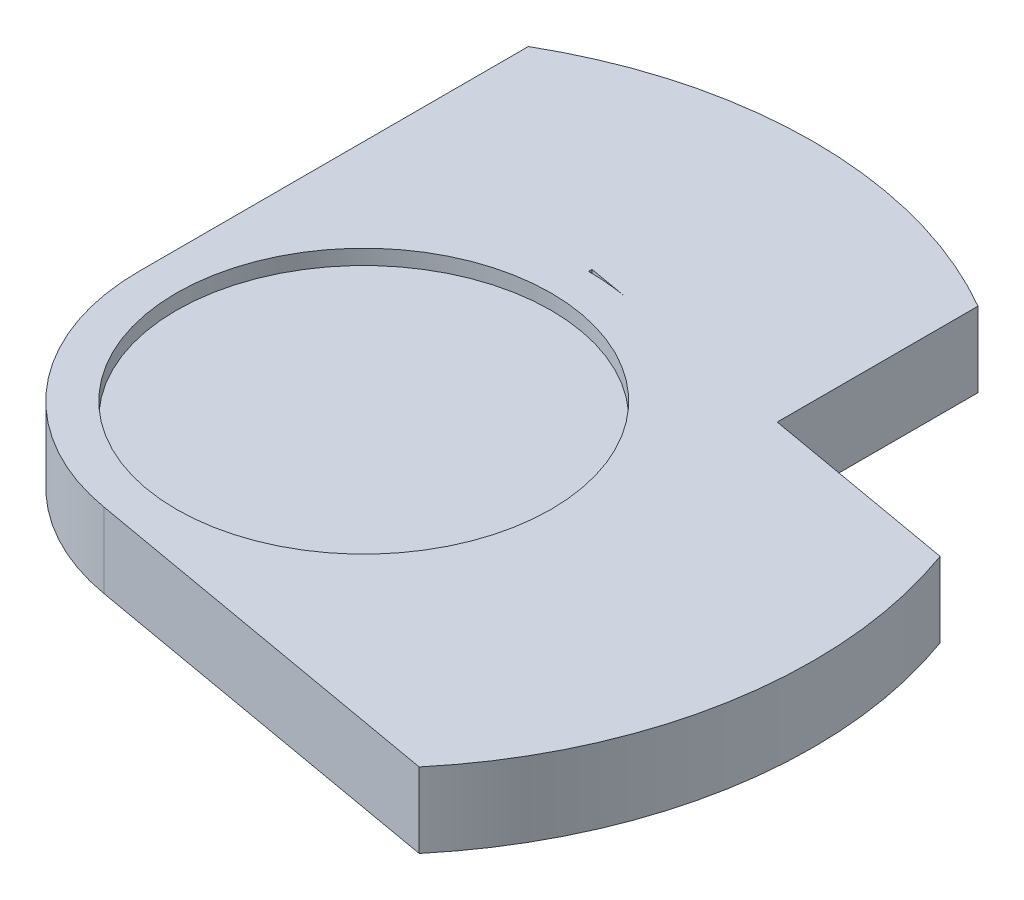
ISO-10303-21;
HEADER;
FILE_DESCRIPTION(('STEP AP214'),'2;1');
FILE_NAME('part.step','',(''),(''),'','','');
FILE_SCHEMA(('AUTOMOTIVE_DESIGN { 1 0 10303 214 1 1 1 1 }'));
ENDSEC;
DATA;
#1=APPLICATION_CONTEXT('core data for automotive mechanical design processes');
#2=APPLICATION_PROTOCOL_DEFINITION('international standard','automotive_design',2000,#1);
#3=PRODUCT_CONTEXT('',#1,'mechanical');
#4=PRODUCT('Part','Part','',(#3));
#5=PRODUCT_RELATED_PRODUCT_CATEGORY('part','',(#4));
#6=PRODUCT_DEFINITION_FORMATION('','',#4);
#7=PRODUCT_DEFINITION_CONTEXT('part definition',#1,'design');
#8=PRODUCT_DEFINITION('design','',#6,#7);
#9=PRODUCT_DEFINITION_SHAPE('','',#8);
#10=(LENGTH_UNIT() NAMED_UNIT(*) SI_UNIT(.MILLI.,.METRE.));
#11=(NAMED_UNIT(*) PLANE_ANGLE_UNIT() SI_UNIT($,.RADIAN.));
#12=(NAMED_UNIT(*) SI_UNIT($,.STERADIAN.) SOLID_ANGLE_UNIT());
#13=UNCERTAINTY_MEASURE_WITH_UNIT(LENGTH_MEASURE(1.E-05),#10,'distance_accuracy_value','');
#14=(GEOMETRIC_REPRESENTATION_CONTEXT(3) GLOBAL_UNCERTAINTY_ASSIGNED_CONTEXT((#13)) GLOBAL_UNIT_ASSIGNED_CONTEXT((#10,
#11,#12)) REPRESENTATION_CONTEXT('',''));
#15=CARTESIAN_POINT('',(0.,0.,0.));
#16=DIRECTION('',(0.,0.,1.));
#17=DIRECTION('',(1.,0.,0.));
#18=AXIS2_PLACEMENT_3D('',#15,#16,#17);
#19=CARTESIAN_POINT('',(3.,1.,0.));
#20=DIRECTION('',(-1.,0.,0.));
#21=DIRECTION('',(0.,0.,1.));
#22=AXIS2_PLACEMENT_3D('',#19,#20,#21);
#23=PLANE('',#22);
#24=DIRECTION('',(0.,-1.,0.));
#25=VECTOR('',#24,1.);
#26=CARTESIAN_POINT('',(3.,1.,-5.19615242270621));
#27=LINE('',#26,#25);
#28=CARTESIAN_POINT('',(3.,1.,-5.19615242270621));
#29=VERTEX_POINT('',#28);
#30=CARTESIAN_POINT('',(3.,0.,-5.19615242270621));
#31=VERTEX_POINT('',#30);
#32=EDGE_CURVE('E60',#29,#31,#27,.T.);
#33=ORIENTED_EDGE('',*,*,#32,.F.);
#34=DIRECTION('',(0.,0.,-1.));
#35=VECTOR('',#34,1.);
#36=CARTESIAN_POINT('',(3.,1.,0.));
#37=LINE('',#36,#35);
#38=CARTESIAN_POINT('',(3.,1.,-2.51729889353182));
#39=VERTEX_POINT('',#38);
#40=EDGE_CURVE('E125',#39,#29,#37,.T.);
#41=ORIENTED_EDGE('',*,*,#40,.F.);
#42=DIRECTION('',(0.,-1.,0.));
#43=VECTOR('',#42,1.);
#44=CARTESIAN_POINT('',(3.,1.,-2.51729889353182));
#45=LINE('',#44,#43);
#46=CARTESIAN_POINT('',(3.,0.,-2.51729889353182));
#47=VERTEX_POINT('',#46);
#48=EDGE_CURVE('E161',#39,#47,#45,.T.);
#49=ORIENTED_EDGE('',*,*,#48,.T.);
#50=DIRECTION('',(0.,0.,-1.));
#51=VECTOR('',#50,1.);
#52=CARTESIAN_POINT('',(3.,0.,0.));
#53=LINE('',#52,#51);
#54=EDGE_CURVE('E128',#47,#31,#53,.T.);
#55=ORIENTED_EDGE('',*,*,#54,.T.);
#56=EDGE_LOOP('',(#33,#41,#49,#55));
#57=FACE_BOUND('',#56,.T.);
#58=ADVANCED_FACE('F37',(#57),#23,.F.);
#59=CARTESIAN_POINT('',(-3.,1.,0.));
#60=DIRECTION('',(-1.,0.,0.));
#61=DIRECTION('',(0.,0.,1.));
#62=AXIS2_PLACEMENT_3D('',#59,#60,#61);
#63=PLANE('',#62);
#64=DIRECTION('',(0.,0.,-1.));
#65=VECTOR('',#64,1.);
#66=CARTESIAN_POINT('',(-3.,1.,0.));
#67=LINE('',#66,#65);
#68=CARTESIAN_POINT('',(-3.,1.,0.));
#69=VERTEX_POINT('',#68);
#70=CARTESIAN_POINT('',(-3.,1.,-5.19615242270606));
#71=VERTEX_POINT('',#70);
#72=EDGE_CURVE('E136',#69,#71,#67,.T.);
#73=ORIENTED_EDGE('',*,*,#72,.T.);
#74=DIRECTION('',(0.,-1.,0.));
#75=VECTOR('',#74,1.);
#76=CARTESIAN_POINT('',(-3.,1.,-5.19615242270606));
#77=LINE('',#76,#75);
#78=CARTESIAN_POINT('',(-3.,0.,-5.19615242270606));
#79=VERTEX_POINT('',#78);
#80=EDGE_CURVE('E115',#71,#79,#77,.T.);
#81=ORIENTED_EDGE('',*,*,#80,.T.);
#82=DIRECTION('',(0.,0.,-1.));
#83=VECTOR('',#82,1.);
#84=CARTESIAN_POINT('',(-3.,0.,0.));
#85=LINE('',#84,#83);
#86=CARTESIAN_POINT('',(-3.,0.,0.));
#87=VERTEX_POINT('',#86);
#88=EDGE_CURVE('E163',#87,#79,#85,.T.);
#89=ORIENTED_EDGE('',*,*,#88,.F.);
#90=DIRECTION('',(0.,-1.,0.));
#91=VECTOR('',#90,1.);
#92=CARTESIAN_POINT('',(-3.,1.,0.));
#93=LINE('',#92,#91);
#94=EDGE_CURVE('E177',#69,#87,#93,.T.);
#95=ORIENTED_EDGE('',*,*,#94,.F.);
#96=EDGE_LOOP('',(#73,#81,#89,#95));
#97=FACE_BOUND('',#96,.T.);
#98=ADVANCED_FACE('F244',(#97),#63,.T.);
#99=CARTESIAN_POINT('',(-0.520952490067851,1.,2.95439650758947));
#100=DIRECTION('',(-0.173652274999197,0.,0.984807030533192));
#101=DIRECTION('',(0.984807030533192,0.,0.173652274999197));
#102=AXIS2_PLACEMENT_3D('',#99,#100,#101);
#103=PLANE('',#102);
#104=DIRECTION('',(-0.984807030533192,0.,-0.173652274999197));
#105=VECTOR('',#104,1.);
#106=CARTESIAN_POINT('',(-0.520952490067851,0.,2.95439650758947));
#107=LINE('',#106,#105);
#108=CARTESIAN_POINT('',(4.59626914104232,0.,3.85672269979412));
#109=VERTEX_POINT('',#108);
#110=CARTESIAN_POINT('',(-0.508900003537394,0.,2.95652173785339));
#111=VERTEX_POINT('',#110);
#112=EDGE_CURVE('E170',#109,#111,#107,.T.);
#113=ORIENTED_EDGE('',*,*,#112,.F.);
#114=DIRECTION('',(0.,-1.,0.));
#115=VECTOR('',#114,1.);
#116=CARTESIAN_POINT('',(4.59626914104232,1.,3.85672269979412));
#117=LINE('',#116,#115);
#118=CARTESIAN_POINT('',(4.59626914104232,1.,3.85672269979412));
#119=VERTEX_POINT('',#118);
#120=EDGE_CURVE('E52',#109,#119,#117,.F.);
#121=ORIENTED_EDGE('',*,*,#120,.T.);
#122=DIRECTION('',(-0.984807030533192,0.,-0.173652274999197));
#123=VECTOR('',#122,1.);
#124=CARTESIAN_POINT('',(-0.520952490067851,1.,2.95439650758947));
#125=LINE('',#124,#123);
#126=CARTESIAN_POINT('',(-0.508900003537394,1.,2.95652173785339));
#127=VERTEX_POINT('',#126);
#128=EDGE_CURVE('E40',#119,#127,#125,.T.);
#129=ORIENTED_EDGE('',*,*,#128,.T.);
#130=DIRECTION('',(0.,-1.,0.));
#131=VECTOR('',#130,1.);
#132=CARTESIAN_POINT('',(-0.508900003537394,1.,2.95652173785339));
#133=LINE('',#132,#131);
#134=EDGE_CURVE('E191',#127,#111,#133,.T.);
#135=ORIENTED_EDGE('',*,*,#134,.T.);
#136=EDGE_LOOP('',(#113,#121,#129,#135));
#137=FACE_BOUND('',#136,.T.);
#138=ADVANCED_FACE('F248',(#137),#103,.T.);
#139=CARTESIAN_POINT('',(0.520944533000813,1.,-2.95442325903662));
#140=DIRECTION('',(0.173648177666938,0.,-0.984807753012207));
#141=DIRECTION('',(-0.984807753012207,0.,-0.173648177666938));
#142=AXIS2_PLACEMENT_3D('',#139,#140,#141);
#143=PLANE('',#142);
#144=DIRECTION('',(0.984807753012207,0.,0.173648177666938));
#145=VECTOR('',#144,1.);
#146=CARTESIAN_POINT('',(0.520944533000813,1.,-2.95442325903662));
#147=LINE('',#146,#145);
#148=CARTESIAN_POINT('',(5.63815572471542,1.,-2.05212085995398));
#149=VERTEX_POINT('',#148);
#150=EDGE_CURVE('E135',#39,#149,#147,.T.);
#151=ORIENTED_EDGE('',*,*,#150,.T.);
#152=DIRECTION('',(0.,-1.,0.));
#153=VECTOR('',#152,1.);
#154=CARTESIAN_POINT('',(5.63815572471542,1.,-2.05212085995398));
#155=LINE('',#154,#153);
#156=CARTESIAN_POINT('',(5.63815572471542,0.,-2.05212085995398));
#157=VERTEX_POINT('',#156);
#158=EDGE_CURVE('E213',#149,#157,#155,.T.);
#159=ORIENTED_EDGE('',*,*,#158,.T.);
#160=DIRECTION('',(0.984807753012207,0.,0.173648177666938));
#161=VECTOR('',#160,1.);
#162=CARTESIAN_POINT('',(0.520944533000813,0.,-2.95442325903662));
#163=LINE('',#162,#161);
#164=EDGE_CURVE('E173',#47,#157,#163,.T.);
#165=ORIENTED_EDGE('',*,*,#164,.F.);
#166=ORIENTED_EDGE('',*,*,#48,.F.);
#167=EDGE_LOOP('',(#151,#159,#165,#166));
#168=FACE_BOUND('',#167,.T.);
#169=ADVANCED_FACE('F212',(#168),#143,.T.);
#170=CARTESIAN_POINT('',(0.,1.,0.));
#171=DIRECTION('',(0.,1.,0.));
#172=DIRECTION('',(0.,0.,1.));
#173=AXIS2_PLACEMENT_3D('',#170,#171,#172);
#174=PLANE('',#173);
#175=CARTESIAN_POINT('',(0.,1.,0.));
#176=DIRECTION('',(0.,1.,0.));
#177=DIRECTION('',(0.,0.,1.));
#178=AXIS2_PLACEMENT_3D('',#175,#176,#177);
#179=CIRCLE('',#178,2.5);
#180=CARTESIAN_POINT('',(0.,1.,2.5));
#181=VERTEX_POINT('',#180);
#182=EDGE_CURVE('E129',#181,#181,#179,.T.);
#183=ORIENTED_EDGE('',*,*,#182,.F.);
#184=EDGE_LOOP('',(#183));
#185=FACE_BOUND('',#184,.T.);
#186=DIRECTION('',(0.984807753012207,0.,0.173648177666938));
#187=VECTOR('',#186,1.);
#188=CARTESIAN_POINT('',(0.520944533000813,1.,-2.95442325903662));
#189=LINE('',#188,#187);
#190=CARTESIAN_POINT('',(0.,1.,-3.04627983565724));
#191=VERTEX_POINT('',#190);
#192=CARTESIAN_POINT('',(0.520944533000813,1.,-2.95442325903662));
#193=VERTEX_POINT('',#192);
#194=EDGE_CURVE('E151',#191,#193,#189,.T.);
#195=ORIENTED_EDGE('',*,*,#194,.T.);
#196=CARTESIAN_POINT('',(0.,1.,0.));
#197=DIRECTION('',(0.,1.,0.));
#198=DIRECTION('',(0.,0.,1.));
#199=AXIS2_PLACEMENT_3D('',#196,#197,#198);
#200=CIRCLE('',#199,3.);
#201=CARTESIAN_POINT('',(0.,1.,-3.));
#202=VERTEX_POINT('',#201);
#203=EDGE_CURVE('E156',#193,#202,#200,.T.);
#204=ORIENTED_EDGE('',*,*,#203,.T.);
#205=DIRECTION('',(0.,0.,1.));
#206=VECTOR('',#205,1.);
#207=CARTESIAN_POINT('',(0.,1.,0.));
#208=LINE('',#207,#206);
#209=EDGE_CURVE('E158',#191,#202,#208,.T.);
#210=ORIENTED_EDGE('',*,*,#209,.F.);
#211=EDGE_LOOP('',(#195,#204,#210));
#212=FACE_BOUND('',#211,.T.);
#213=ORIENTED_EDGE('',*,*,#128,.F.);
#214=CARTESIAN_POINT('',(1.31838984174237E-13,1.,4.9960036108132E-13));
#215=DIRECTION('',(0.,-1.,0.));
#216=DIRECTION('',(0.,0.,-1.));
#217=AXIS2_PLACEMENT_3D('',#214,#215,#216);
#218=CIRCLE('',#217,6.);
#219=EDGE_CURVE('E120',#149,#119,#218,.T.);
#220=ORIENTED_EDGE('',*,*,#219,.F.);
#221=ORIENTED_EDGE('',*,*,#150,.F.);
#222=ORIENTED_EDGE('',*,*,#40,.T.);
#223=EDGE_CURVE('E112',#71,#29,#218,.T.);
#224=ORIENTED_EDGE('',*,*,#223,.F.);
#225=ORIENTED_EDGE('',*,*,#72,.F.);
#226=CARTESIAN_POINT('',(0.,1.,0.));
#227=DIRECTION('',(0.,1.,0.));
#228=DIRECTION('',(0.,0.,1.));
#229=AXIS2_PLACEMENT_3D('',#226,#227,#228);
#230=CIRCLE('',#229,3.);
#231=EDGE_CURVE('E139',#69,#127,#230,.T.);
#232=ORIENTED_EDGE('',*,*,#231,.T.);
#233=EDGE_LOOP('',(#213,#220,#221,#222,#224,#225,#232));
#234=FACE_BOUND('',#233,.T.);
#235=ADVANCED_FACE('F132',(#185,#212,#234),#174,.T.);
#236=CARTESIAN_POINT('',(0.,0.,0.));
#237=DIRECTION('',(0.,1.,0.));
#238=DIRECTION('',(0.,0.,1.));
#239=AXIS2_PLACEMENT_3D('',#236,#237,#238);
#240=PLANE('',#239);
#241=DIRECTION('',(0.984807753012207,0.,0.173648177666938));
#242=VECTOR('',#241,1.);
#243=CARTESIAN_POINT('',(0.520944533000813,0.,-2.95442325903662));
#244=LINE('',#243,#242);
#245=CARTESIAN_POINT('',(0.,0.,-3.04627983565724));
#246=VERTEX_POINT('',#245);
#247=CARTESIAN_POINT('',(0.520944533000813,0.,-2.95442325903662));
#248=VERTEX_POINT('',#247);
#249=EDGE_CURVE('E204',#246,#248,#244,.T.);
#250=ORIENTED_EDGE('',*,*,#249,.F.);
#251=DIRECTION('',(0.,0.,1.));
#252=VECTOR('',#251,1.);
#253=CARTESIAN_POINT('',(0.,0.,0.));
#254=LINE('',#253,#252);
#255=CARTESIAN_POINT('',(0.,0.,-3.));
#256=VERTEX_POINT('',#255);
#257=EDGE_CURVE('E137',#246,#256,#254,.T.);
#258=ORIENTED_EDGE('',*,*,#257,.T.);
#259=CARTESIAN_POINT('',(0.,0.,0.));
#260=DIRECTION('',(0.,1.,0.));
#261=DIRECTION('',(0.,0.,1.));
#262=AXIS2_PLACEMENT_3D('',#259,#260,#261);
#263=CIRCLE('',#262,3.);
#264=EDGE_CURVE('E142',#248,#256,#263,.T.);
#265=ORIENTED_EDGE('',*,*,#264,.F.);
#266=EDGE_LOOP('',(#250,#258,#265));
#267=FACE_BOUND('',#266,.T.);
#268=CARTESIAN_POINT('',(1.31838984174237E-13,0.,4.9960036108132E-13));
#269=DIRECTION('',(0.,1.,0.));
#270=DIRECTION('',(0.,0.,1.));
#271=AXIS2_PLACEMENT_3D('',#268,#269,#270);
#272=CIRCLE('',#271,6.);
#273=EDGE_CURVE('E12',#109,#157,#272,.T.);
#274=ORIENTED_EDGE('',*,*,#273,.F.);
#275=ORIENTED_EDGE('',*,*,#112,.T.);
#276=CARTESIAN_POINT('',(0.,0.,0.));
#277=DIRECTION('',(0.,1.,0.));
#278=DIRECTION('',(0.,0.,1.));
#279=AXIS2_PLACEMENT_3D('',#276,#277,#278);
#280=CIRCLE('',#279,3.);
#281=EDGE_CURVE('E167',#87,#111,#280,.T.);
#282=ORIENTED_EDGE('',*,*,#281,.F.);
#283=ORIENTED_EDGE('',*,*,#88,.T.);
#284=EDGE_CURVE('E46',#31,#79,#272,.T.);
#285=ORIENTED_EDGE('',*,*,#284,.F.);
#286=ORIENTED_EDGE('',*,*,#54,.F.);
#287=ORIENTED_EDGE('',*,*,#164,.T.);
#288=EDGE_LOOP('',(#274,#275,#282,#283,#285,#286,#287));
#289=FACE_BOUND('',#288,.T.);
#290=ADVANCED_FACE('F209',(#267,#289),#240,.F.);
#291=CARTESIAN_POINT('',(0.520944533000813,1.,-2.95442325903662));
#292=DIRECTION('',(0.173648177666938,0.,-0.984807753012207));
#293=DIRECTION('',(-0.984807753012207,0.,-0.173648177666938));
#294=AXIS2_PLACEMENT_3D('',#291,#292,#293);
#295=PLANE('',#294);
#296=ORIENTED_EDGE('',*,*,#249,.T.);
#297=DIRECTION('',(0.,-1.,0.));
#298=VECTOR('',#297,1.);
#299=CARTESIAN_POINT('',(0.520944533000813,1.,-2.95442325903662));
#300=LINE('',#299,#298);
#301=EDGE_CURVE('E179',#193,#248,#300,.T.);
#302=ORIENTED_EDGE('',*,*,#301,.F.);
#303=ORIENTED_EDGE('',*,*,#194,.F.);
#304=DIRECTION('',(0.,-1.,0.));
#305=VECTOR('',#304,1.);
#306=CARTESIAN_POINT('',(0.,1.,-3.04627983565724));
#307=LINE('',#306,#305);
#308=EDGE_CURVE('E187',#191,#246,#307,.T.);
#309=ORIENTED_EDGE('',*,*,#308,.T.);
#310=EDGE_LOOP('',(#296,#302,#303,#309));
#311=FACE_BOUND('',#310,.T.);
#312=ADVANCED_FACE('F230',(#311),#295,.F.);
#313=CARTESIAN_POINT('',(0.,1.,0.));
#314=DIRECTION('',(0.,-1.,0.));
#315=DIRECTION('',(0.,0.,-1.));
#316=AXIS2_PLACEMENT_3D('',#313,#314,#315);
#317=CYLINDRICAL_SURFACE('',#316,3.);
#318=ORIENTED_EDGE('',*,*,#264,.T.);
#319=DIRECTION('',(0.,-1.,0.));
#320=VECTOR('',#319,1.);
#321=CARTESIAN_POINT('',(0.,1.,-3.));
#322=LINE('',#321,#320);
#323=EDGE_CURVE('E181',#202,#256,#322,.T.);
#324=ORIENTED_EDGE('',*,*,#323,.F.);
#325=ORIENTED_EDGE('',*,*,#203,.F.);
#326=ORIENTED_EDGE('',*,*,#301,.T.);
#327=EDGE_LOOP('',(#318,#324,#325,#326));
#328=FACE_BOUND('',#327,.T.);
#329=ADVANCED_FACE('F232',(#328),#317,.T.);
#330=CARTESIAN_POINT('',(0.,1.,0.));
#331=DIRECTION('',(0.,-1.,0.));
#332=DIRECTION('',(0.,0.,-1.));
#333=AXIS2_PLACEMENT_3D('',#330,#331,#332);
#334=CYLINDRICAL_SURFACE('',#333,3.);
#335=ORIENTED_EDGE('',*,*,#281,.T.);
#336=ORIENTED_EDGE('',*,*,#134,.F.);
#337=ORIENTED_EDGE('',*,*,#231,.F.);
#338=ORIENTED_EDGE('',*,*,#94,.T.);
#339=EDGE_LOOP('',(#335,#336,#337,#338));
#340=FACE_BOUND('',#339,.T.);
#341=ADVANCED_FACE('F238',(#340),#334,.T.);
#342=CARTESIAN_POINT('',(0.,1.,0.));
#343=DIRECTION('',(1.,0.,0.));
#344=DIRECTION('',(0.,0.,-1.));
#345=AXIS2_PLACEMENT_3D('',#342,#343,#344);
#346=PLANE('',#345);
#347=ORIENTED_EDGE('',*,*,#257,.F.);
#348=ORIENTED_EDGE('',*,*,#308,.F.);
#349=ORIENTED_EDGE('',*,*,#209,.T.);
#350=ORIENTED_EDGE('',*,*,#323,.T.);
#351=EDGE_LOOP('',(#347,#348,#349,#350));
#352=FACE_BOUND('',#351,.T.);
#353=ADVANCED_FACE('F256',(#352),#346,.T.);
#354=CARTESIAN_POINT('',(0.,0.8,0.));
#355=DIRECTION('',(0.,1.,0.));
#356=DIRECTION('',(0.,0.,1.));
#357=AXIS2_PLACEMENT_3D('',#354,#355,#356);
#358=CYLINDRICAL_SURFACE('',#357,2.5);
#359=CARTESIAN_POINT('',(0.,0.8,0.));
#360=DIRECTION('',(0.,1.,0.));
#361=DIRECTION('',(0.,0.,1.));
#362=AXIS2_PLACEMENT_3D('',#359,#360,#361);
#363=CIRCLE('',#362,2.5);
#364=CARTESIAN_POINT('',(0.,0.8,2.5));
#365=VERTEX_POINT('',#364);
#366=EDGE_CURVE('E164',#365,#365,#363,.T.);
#367=ORIENTED_EDGE('',*,*,#366,.F.);
#368=EDGE_LOOP('',(#367));
#369=FACE_BOUND('',#368,.T.);
#370=ORIENTED_EDGE('',*,*,#182,.T.);
#371=EDGE_LOOP('',(#370));
#372=FACE_BOUND('',#371,.T.);
#373=ADVANCED_FACE('F223',(#369,#372),#358,.F.);
#374=CARTESIAN_POINT('',(0.,0.8,0.));
#375=DIRECTION('',(0.,1.,0.));
#376=DIRECTION('',(0.,0.,1.));
#377=AXIS2_PLACEMENT_3D('',#374,#375,#376);
#378=PLANE('',#377);
#379=ORIENTED_EDGE('',*,*,#366,.T.);
#380=EDGE_LOOP('',(#379));
#381=FACE_BOUND('',#380,.T.);
#382=ADVANCED_FACE('F282',(#381),#378,.T.);
#383=CARTESIAN_POINT('',(1.31838984174237E-13,1.,4.9960036108132E-13));
#384=DIRECTION('',(0.,-1.,0.));
#385=DIRECTION('',(0.,0.,-1.));
#386=AXIS2_PLACEMENT_3D('',#383,#384,#385);
#387=CYLINDRICAL_SURFACE('',#386,6.);
#388=ORIENTED_EDGE('',*,*,#32,.T.);
#389=ORIENTED_EDGE('',*,*,#284,.T.);
#390=ORIENTED_EDGE('',*,*,#80,.F.);
#391=ORIENTED_EDGE('',*,*,#223,.T.);
#392=EDGE_LOOP('',(#388,#389,#390,#391));
#393=FACE_BOUND('',#392,.T.);
#394=ADVANCED_FACE('F113',(#393),#387,.T.);
#395=ORIENTED_EDGE('',*,*,#273,.T.);
#396=ORIENTED_EDGE('',*,*,#158,.F.);
#397=ORIENTED_EDGE('',*,*,#219,.T.);
#398=ORIENTED_EDGE('',*,*,#120,.F.);
#399=EDGE_LOOP('',(#395,#396,#397,#398));
#400=FACE_BOUND('',#399,.T.);
#401=ADVANCED_FACE('F281',(#400),#387,.T.);
#402=CLOSED_SHELL('',(#58,#98,#138,#169,#235,#290,#312,#329,#341,#353,#373,#382,#394,#401));
#403=MANIFOLD_SOLID_BREP('B2',#402);
#404=ADVANCED_BREP_SHAPE_REPRESENTATION('',(#18,#403),#14);
#405=SHAPE_DEFINITION_REPRESENTATION(#9,#404);
ENDSEC;
END-ISO-10303-21;
